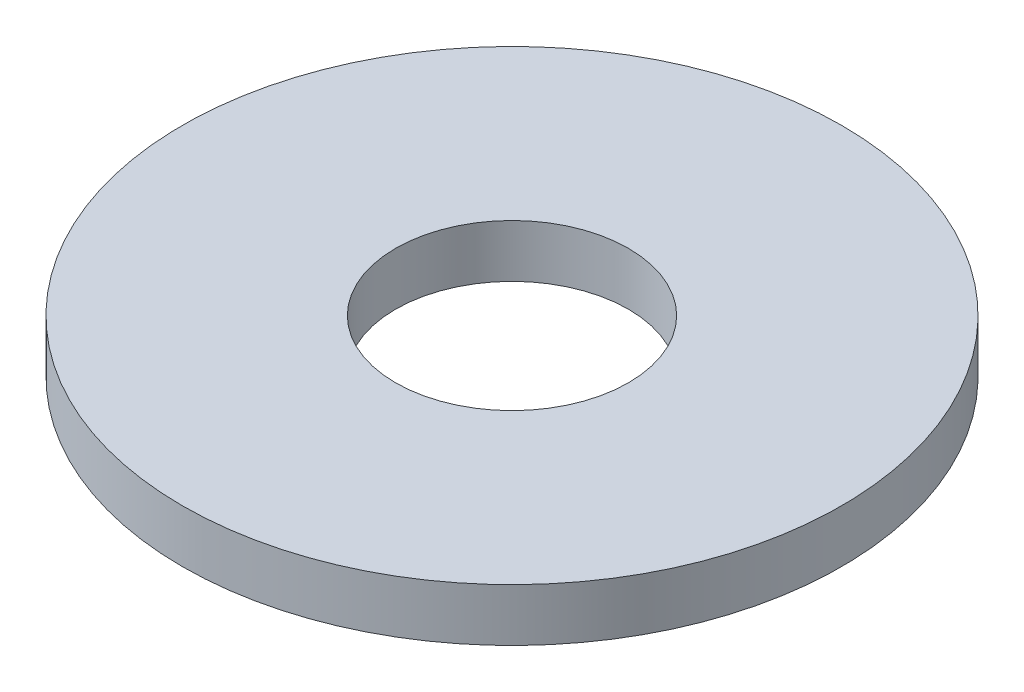
ISO-10303-21;
HEADER;
FILE_DESCRIPTION(('STEP AP214'),'2;1');
FILE_NAME('part.step','',(''),(''),'','','');
FILE_SCHEMA(('AUTOMOTIVE_DESIGN { 1 0 10303 214 1 1 1 1 }'));
ENDSEC;
DATA;
#1=APPLICATION_CONTEXT('core data for automotive mechanical design processes');
#2=APPLICATION_PROTOCOL_DEFINITION('international standard','automotive_design',2000,#1);
#3=PRODUCT_CONTEXT('',#1,'mechanical');
#4=PRODUCT('Part','Part','',(#3));
#5=PRODUCT_RELATED_PRODUCT_CATEGORY('part','',(#4));
#6=PRODUCT_DEFINITION_FORMATION('','',#4);
#7=PRODUCT_DEFINITION_CONTEXT('part definition',#1,'design');
#8=PRODUCT_DEFINITION('design','',#6,#7);
#9=PRODUCT_DEFINITION_SHAPE('','',#8);
#10=(LENGTH_UNIT() NAMED_UNIT(*) SI_UNIT(.MILLI.,.METRE.));
#11=(NAMED_UNIT(*) PLANE_ANGLE_UNIT() SI_UNIT($,.RADIAN.));
#12=(NAMED_UNIT(*) SI_UNIT($,.STERADIAN.) SOLID_ANGLE_UNIT());
#13=UNCERTAINTY_MEASURE_WITH_UNIT(LENGTH_MEASURE(1.E-05),#10,'distance_accuracy_value','');
#14=(GEOMETRIC_REPRESENTATION_CONTEXT(3) GLOBAL_UNCERTAINTY_ASSIGNED_CONTEXT((#13)) GLOBAL_UNIT_ASSIGNED_CONTEXT((#10,
#11,#12)) REPRESENTATION_CONTEXT('',''));
#15=CARTESIAN_POINT('',(0.,0.,0.));
#16=DIRECTION('',(0.,0.,1.));
#17=DIRECTION('',(1.,0.,0.));
#18=AXIS2_PLACEMENT_3D('',#15,#16,#17);
#19=CARTESIAN_POINT('',(0.,1.2,0.));
#20=DIRECTION('',(0.,1.,0.));
#21=DIRECTION('',(0.,0.,1.));
#22=AXIS2_PLACEMENT_3D('',#19,#20,#21);
#23=PLANE('',#22);
#24=CARTESIAN_POINT('',(0.,1.2,0.));
#25=DIRECTION('',(0.,1.,0.));
#26=DIRECTION('',(0.,0.,1.));
#27=AXIS2_PLACEMENT_3D('',#24,#25,#26);
#28=CIRCLE('',#27,7.5);
#29=CARTESIAN_POINT('',(0.,1.2,7.5));
#30=VERTEX_POINT('',#29);
#31=EDGE_CURVE('E10',#30,#30,#28,.T.);
#32=ORIENTED_EDGE('',*,*,#31,.T.);
#33=EDGE_LOOP('',(#32));
#34=FACE_BOUND('',#33,.T.);
#35=CARTESIAN_POINT('',(0.,1.2,0.));
#36=DIRECTION('',(0.,1.,0.));
#37=DIRECTION('',(0.,0.,1.));
#38=AXIS2_PLACEMENT_3D('',#35,#36,#37);
#39=CIRCLE('',#38,2.65);
#40=CARTESIAN_POINT('',(0.,1.2,2.65));
#41=VERTEX_POINT('',#40);
#42=EDGE_CURVE('E44',#41,#41,#39,.T.);
#43=ORIENTED_EDGE('',*,*,#42,.F.);
#44=EDGE_LOOP('',(#43));
#45=FACE_BOUND('',#44,.T.);
#46=ADVANCED_FACE('F33',(#34,#45),#23,.T.);
#47=CARTESIAN_POINT('',(0.,0.,0.));
#48=DIRECTION('',(0.,1.,0.));
#49=DIRECTION('',(0.,0.,1.));
#50=AXIS2_PLACEMENT_3D('',#47,#48,#49);
#51=PLANE('',#50);
#52=CARTESIAN_POINT('',(0.,0.,0.));
#53=DIRECTION('',(0.,1.,0.));
#54=DIRECTION('',(0.,0.,1.));
#55=AXIS2_PLACEMENT_3D('',#52,#53,#54);
#56=CIRCLE('',#55,7.5);
#57=CARTESIAN_POINT('',(0.,0.,7.5));
#58=VERTEX_POINT('',#57);
#59=EDGE_CURVE('E37',#58,#58,#56,.T.);
#60=ORIENTED_EDGE('',*,*,#59,.F.);
#61=EDGE_LOOP('',(#60));
#62=FACE_BOUND('',#61,.T.);
#63=CARTESIAN_POINT('',(0.,0.,0.));
#64=DIRECTION('',(0.,1.,0.));
#65=DIRECTION('',(0.,0.,1.));
#66=AXIS2_PLACEMENT_3D('',#63,#64,#65);
#67=CIRCLE('',#66,2.65);
#68=CARTESIAN_POINT('',(0.,0.,2.65));
#69=VERTEX_POINT('',#68);
#70=EDGE_CURVE('E46',#69,#69,#67,.T.);
#71=ORIENTED_EDGE('',*,*,#70,.T.);
#72=EDGE_LOOP('',(#71));
#73=FACE_BOUND('',#72,.T.);
#74=ADVANCED_FACE('F56',(#62,#73),#51,.F.);
#75=CARTESIAN_POINT('',(0.,1.2,0.));
#76=DIRECTION('',(0.,-1.,0.));
#77=DIRECTION('',(0.,0.,-1.));
#78=AXIS2_PLACEMENT_3D('',#75,#76,#77);
#79=CYLINDRICAL_SURFACE('',#78,7.5);
#80=ORIENTED_EDGE('',*,*,#31,.F.);
#81=EDGE_LOOP('',(#80));
#82=FACE_BOUND('',#81,.T.);
#83=ORIENTED_EDGE('',*,*,#59,.T.);
#84=EDGE_LOOP('',(#83));
#85=FACE_BOUND('',#84,.T.);
#86=ADVANCED_FACE('F35',(#82,#85),#79,.T.);
#87=CARTESIAN_POINT('',(0.,1.2,0.));
#88=DIRECTION('',(0.,-1.,0.));
#89=DIRECTION('',(0.,0.,-1.));
#90=AXIS2_PLACEMENT_3D('',#87,#88,#89);
#91=CYLINDRICAL_SURFACE('',#90,2.65);
#92=ORIENTED_EDGE('',*,*,#42,.T.);
#93=EDGE_LOOP('',(#92));
#94=FACE_BOUND('',#93,.T.);
#95=ORIENTED_EDGE('',*,*,#70,.F.);
#96=EDGE_LOOP('',(#95));
#97=FACE_BOUND('',#96,.T.);
#98=ADVANCED_FACE('F52',(#94,#97),#91,.F.);
#99=CLOSED_SHELL('',(#46,#74,#86,#98));
#100=MANIFOLD_SOLID_BREP('B2',#99);
#101=ADVANCED_BREP_SHAPE_REPRESENTATION('',(#18,#100),#14);
#102=SHAPE_DEFINITION_REPRESENTATION(#9,#101);
ENDSEC;
END-ISO-10303-21;
